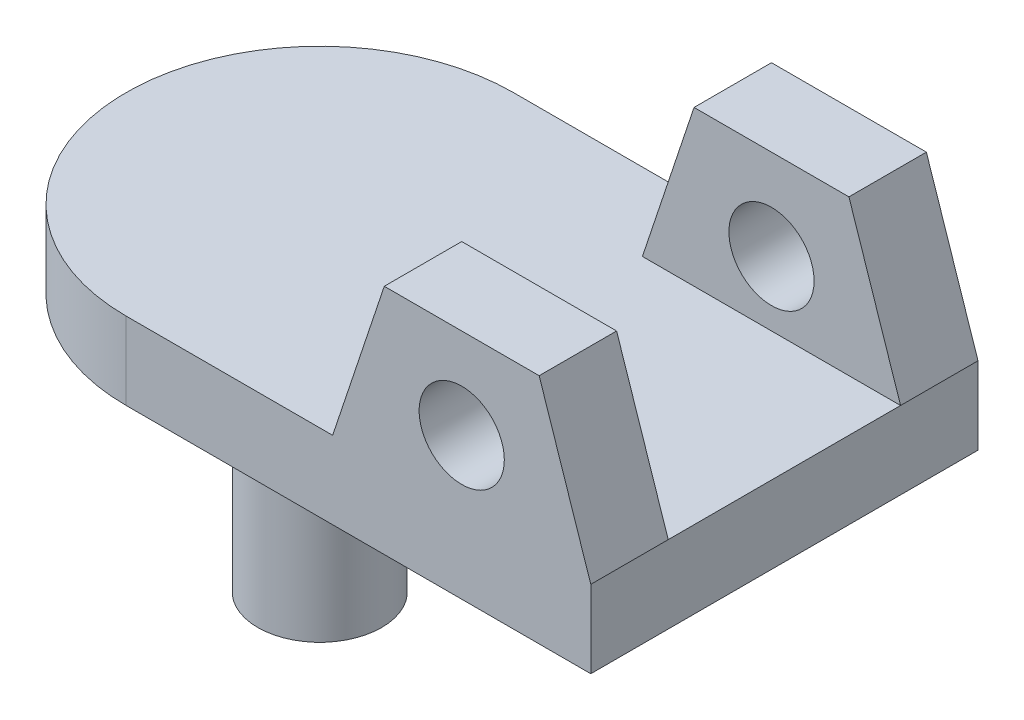
ISO-10303-21;
HEADER;
FILE_DESCRIPTION(('STEP AP214'),'2;1');
FILE_NAME('part.step','',(''),(''),'','','');
FILE_SCHEMA(('AUTOMOTIVE_DESIGN { 1 0 10303 214 1 1 1 1 }'));
ENDSEC;
DATA;
#1=APPLICATION_CONTEXT('core data for automotive mechanical design processes');
#2=APPLICATION_PROTOCOL_DEFINITION('international standard','automotive_design',2000,#1);
#3=PRODUCT_CONTEXT('',#1,'mechanical');
#4=PRODUCT('Part','Part','',(#3));
#5=PRODUCT_RELATED_PRODUCT_CATEGORY('part','',(#4));
#6=PRODUCT_DEFINITION_FORMATION('','',#4);
#7=PRODUCT_DEFINITION_CONTEXT('part definition',#1,'design');
#8=PRODUCT_DEFINITION('design','',#6,#7);
#9=PRODUCT_DEFINITION_SHAPE('','',#8);
#10=(LENGTH_UNIT() NAMED_UNIT(*) SI_UNIT(.MILLI.,.METRE.));
#11=(NAMED_UNIT(*) PLANE_ANGLE_UNIT() SI_UNIT($,.RADIAN.));
#12=(NAMED_UNIT(*) SI_UNIT($,.STERADIAN.) SOLID_ANGLE_UNIT());
#13=UNCERTAINTY_MEASURE_WITH_UNIT(LENGTH_MEASURE(1.E-05),#10,'distance_accuracy_value','');
#14=(GEOMETRIC_REPRESENTATION_CONTEXT(3) GLOBAL_UNCERTAINTY_ASSIGNED_CONTEXT((#13)) GLOBAL_UNIT_ASSIGNED_CONTEXT((#10,
#11,#12)) REPRESENTATION_CONTEXT('',''));
#15=CARTESIAN_POINT('',(0.,0.,0.));
#16=DIRECTION('',(0.,0.,1.));
#17=DIRECTION('',(1.,0.,0.));
#18=AXIS2_PLACEMENT_3D('',#15,#16,#17);
#19=CARTESIAN_POINT('',(0.,3.,0.));
#20=DIRECTION('',(0.,1.,0.));
#21=DIRECTION('',(0.,0.,1.));
#22=AXIS2_PLACEMENT_3D('',#19,#20,#21);
#23=PLANE('',#22);
#24=DIRECTION('',(1.,0.,0.));
#25=VECTOR('',#24,1.);
#26=CARTESIAN_POINT('',(18.,3.,-4.5));
#27=LINE('',#26,#25);
#28=CARTESIAN_POINT('',(8.,3.,-4.5));
#29=VERTEX_POINT('',#28);
#30=CARTESIAN_POINT('',(18.,3.,-4.5));
#31=VERTEX_POINT('',#30);
#32=EDGE_CURVE('E60',#29,#31,#27,.T.);
#33=ORIENTED_EDGE('',*,*,#32,.F.);
#34=DIRECTION('',(0.,0.,-1.));
#35=VECTOR('',#34,1.);
#36=CARTESIAN_POINT('',(8.,3.,-4.5));
#37=LINE('',#36,#35);
#38=CARTESIAN_POINT('',(8.,3.,-7.5));
#39=VERTEX_POINT('',#38);
#40=EDGE_CURVE('E151',#29,#39,#37,.T.);
#41=ORIENTED_EDGE('',*,*,#40,.T.);
#42=DIRECTION('',(-1.,0.,0.));
#43=VECTOR('',#42,1.);
#44=CARTESIAN_POINT('',(0.,3.,-7.5));
#45=LINE('',#44,#43);
#46=CARTESIAN_POINT('',(0.,3.,-7.5));
#47=VERTEX_POINT('',#46);
#48=EDGE_CURVE('E231',#39,#47,#45,.T.);
#49=ORIENTED_EDGE('',*,*,#48,.T.);
#50=CARTESIAN_POINT('',(0.,3.,0.));
#51=DIRECTION('',(0.,1.,0.));
#52=DIRECTION('',(0.,0.,1.));
#53=AXIS2_PLACEMENT_3D('',#50,#51,#52);
#54=CIRCLE('',#53,7.5);
#55=CARTESIAN_POINT('',(0.,3.,7.5));
#56=VERTEX_POINT('',#55);
#57=EDGE_CURVE('E217',#47,#56,#54,.T.);
#58=ORIENTED_EDGE('',*,*,#57,.T.);
#59=DIRECTION('',(1.,0.,0.));
#60=VECTOR('',#59,1.);
#61=CARTESIAN_POINT('',(0.,3.,7.5));
#62=LINE('',#61,#60);
#63=CARTESIAN_POINT('',(8.,3.,7.5));
#64=VERTEX_POINT('',#63);
#65=EDGE_CURVE('E221',#56,#64,#62,.T.);
#66=ORIENTED_EDGE('',*,*,#65,.T.);
#67=DIRECTION('',(0.,0.,1.));
#68=VECTOR('',#67,1.);
#69=CARTESIAN_POINT('',(8.,3.,4.5));
#70=LINE('',#69,#68);
#71=CARTESIAN_POINT('',(8.,3.,4.5));
#72=VERTEX_POINT('',#71);
#73=EDGE_CURVE('E204',#72,#64,#70,.T.);
#74=ORIENTED_EDGE('',*,*,#73,.F.);
#75=DIRECTION('',(1.,0.,0.));
#76=VECTOR('',#75,1.);
#77=CARTESIAN_POINT('',(18.,3.,4.5));
#78=LINE('',#77,#76);
#79=CARTESIAN_POINT('',(18.,3.,4.5));
#80=VERTEX_POINT('',#79);
#81=EDGE_CURVE('E189',#72,#80,#78,.T.);
#82=ORIENTED_EDGE('',*,*,#81,.T.);
#83=DIRECTION('',(0.,0.,-1.));
#84=VECTOR('',#83,1.);
#85=CARTESIAN_POINT('',(18.,3.,-7.5));
#86=LINE('',#85,#84);
#87=EDGE_CURVE('E226',#80,#31,#86,.T.);
#88=ORIENTED_EDGE('',*,*,#87,.T.);
#89=EDGE_LOOP('',(#33,#41,#49,#58,#66,#74,#82,#88));
#90=FACE_BOUND('',#89,.T.);
#91=ADVANCED_FACE('F43',(#90),#23,.T.);
#92=CARTESIAN_POINT('',(0.,3.,0.));
#93=DIRECTION('',(0.,-1.,0.));
#94=DIRECTION('',(0.,0.,-1.));
#95=AXIS2_PLACEMENT_3D('',#92,#93,#94);
#96=CYLINDRICAL_SURFACE('',#95,7.5);
#97=CARTESIAN_POINT('',(0.,0.,0.));
#98=DIRECTION('',(0.,1.,0.));
#99=DIRECTION('',(0.,0.,1.));
#100=AXIS2_PLACEMENT_3D('',#97,#98,#99);
#101=CIRCLE('',#100,7.5);
#102=CARTESIAN_POINT('',(0.,0.,-7.5));
#103=VERTEX_POINT('',#102);
#104=CARTESIAN_POINT('',(0.,0.,7.5));
#105=VERTEX_POINT('',#104);
#106=EDGE_CURVE('E216',#103,#105,#101,.T.);
#107=ORIENTED_EDGE('',*,*,#106,.T.);
#108=DIRECTION('',(0.,-1.,0.));
#109=VECTOR('',#108,1.);
#110=CARTESIAN_POINT('',(0.,3.,7.5));
#111=LINE('',#110,#109);
#112=EDGE_CURVE('E53',#56,#105,#111,.T.);
#113=ORIENTED_EDGE('',*,*,#112,.F.);
#114=ORIENTED_EDGE('',*,*,#57,.F.);
#115=DIRECTION('',(0.,-1.,0.));
#116=VECTOR('',#115,1.);
#117=CARTESIAN_POINT('',(0.,3.,-7.5));
#118=LINE('',#117,#116);
#119=EDGE_CURVE('E234',#47,#103,#118,.T.);
#120=ORIENTED_EDGE('',*,*,#119,.T.);
#121=EDGE_LOOP('',(#107,#113,#114,#120));
#122=FACE_BOUND('',#121,.T.);
#123=ADVANCED_FACE('F45',(#122),#96,.T.);
#124=CARTESIAN_POINT('',(0.,3.,7.5));
#125=DIRECTION('',(0.,0.,-1.));
#126=DIRECTION('',(-1.,0.,0.));
#127=AXIS2_PLACEMENT_3D('',#124,#125,#126);
#128=PLANE('',#127);
#129=CARTESIAN_POINT('',(13.,5.5,7.5));
#130=DIRECTION('',(0.,0.,1.));
#131=DIRECTION('',(1.,0.,0.));
#132=AXIS2_PLACEMENT_3D('',#129,#130,#131);
#133=CIRCLE('',#132,1.65);
#134=CARTESIAN_POINT('',(14.65,5.5,7.5));
#135=VERTEX_POINT('',#134);
#136=EDGE_CURVE('E283',#135,#135,#133,.T.);
#137=ORIENTED_EDGE('',*,*,#136,.F.);
#138=EDGE_LOOP('',(#137));
#139=FACE_BOUND('',#138,.T.);
#140=DIRECTION('',(1.,0.,0.));
#141=VECTOR('',#140,1.);
#142=CARTESIAN_POINT('',(0.,0.,7.5));
#143=LINE('',#142,#141);
#144=CARTESIAN_POINT('',(18.,0.,7.5));
#145=VERTEX_POINT('',#144);
#146=EDGE_CURVE('E238',#105,#145,#143,.T.);
#147=ORIENTED_EDGE('',*,*,#146,.T.);
#148=DIRECTION('',(0.,-1.,0.));
#149=VECTOR('',#148,1.);
#150=CARTESIAN_POINT('',(18.,3.,7.5));
#151=LINE('',#150,#149);
#152=CARTESIAN_POINT('',(18.,3.,7.5));
#153=VERTEX_POINT('',#152);
#154=EDGE_CURVE('E253',#153,#145,#151,.T.);
#155=ORIENTED_EDGE('',*,*,#154,.F.);
#156=DIRECTION('',(-0.316227766016838,0.948683298050514,0.));
#157=VECTOR('',#156,1.);
#158=CARTESIAN_POINT('',(16.,9.,7.5));
#159=LINE('',#158,#157);
#160=CARTESIAN_POINT('',(16.,9.,7.5));
#161=VERTEX_POINT('',#160);
#162=EDGE_CURVE('E171',#153,#161,#159,.T.);
#163=ORIENTED_EDGE('',*,*,#162,.T.);
#164=DIRECTION('',(-1.,0.,0.));
#165=VECTOR('',#164,1.);
#166=CARTESIAN_POINT('',(10.,9.,7.5));
#167=LINE('',#166,#165);
#168=CARTESIAN_POINT('',(10.,9.,7.5));
#169=VERTEX_POINT('',#168);
#170=EDGE_CURVE('E197',#161,#169,#167,.T.);
#171=ORIENTED_EDGE('',*,*,#170,.T.);
#172=DIRECTION('',(-0.316227766016838,-0.948683298050514,0.));
#173=VECTOR('',#172,1.);
#174=CARTESIAN_POINT('',(8.,3.,7.5));
#175=LINE('',#174,#173);
#176=EDGE_CURVE('E182',#169,#64,#175,.T.);
#177=ORIENTED_EDGE('',*,*,#176,.T.);
#178=ORIENTED_EDGE('',*,*,#65,.F.);
#179=ORIENTED_EDGE('',*,*,#112,.T.);
#180=EDGE_LOOP('',(#147,#155,#163,#171,#177,#178,#179));
#181=FACE_BOUND('',#180,.T.);
#182=ADVANCED_FACE('F261',(#139,#181),#128,.F.);
#183=CARTESIAN_POINT('',(18.,3.,-7.5));
#184=DIRECTION('',(-1.,0.,0.));
#185=DIRECTION('',(0.,0.,1.));
#186=AXIS2_PLACEMENT_3D('',#183,#184,#185);
#187=PLANE('',#186);
#188=DIRECTION('',(0.,0.,-1.));
#189=VECTOR('',#188,1.);
#190=CARTESIAN_POINT('',(18.,0.,-7.5));
#191=LINE('',#190,#189);
#192=CARTESIAN_POINT('',(18.,0.,-7.5));
#193=VERTEX_POINT('',#192);
#194=EDGE_CURVE('E241',#145,#193,#191,.T.);
#195=ORIENTED_EDGE('',*,*,#194,.T.);
#196=DIRECTION('',(0.,-1.,0.));
#197=VECTOR('',#196,1.);
#198=CARTESIAN_POINT('',(18.,3.,-7.5));
#199=LINE('',#198,#197);
#200=CARTESIAN_POINT('',(18.,3.,-7.5));
#201=VERTEX_POINT('',#200);
#202=EDGE_CURVE('E249',#201,#193,#199,.T.);
#203=ORIENTED_EDGE('',*,*,#202,.F.);
#204=DIRECTION('',(0.,0.,-1.));
#205=VECTOR('',#204,1.);
#206=CARTESIAN_POINT('',(18.,3.,-4.5));
#207=LINE('',#206,#205);
#208=EDGE_CURVE('E68',#31,#201,#207,.T.);
#209=ORIENTED_EDGE('',*,*,#208,.F.);
#210=ORIENTED_EDGE('',*,*,#87,.F.);
#211=EDGE_CURVE('E227',#153,#80,#86,.T.);
#212=ORIENTED_EDGE('',*,*,#211,.F.);
#213=ORIENTED_EDGE('',*,*,#154,.T.);
#214=EDGE_LOOP('',(#195,#203,#209,#210,#212,#213));
#215=FACE_BOUND('',#214,.T.);
#216=ADVANCED_FACE('F271',(#215),#187,.F.);
#217=CARTESIAN_POINT('',(0.,3.,-7.5));
#218=DIRECTION('',(0.,0.,1.));
#219=DIRECTION('',(1.,0.,0.));
#220=AXIS2_PLACEMENT_3D('',#217,#218,#219);
#221=PLANE('',#220);
#222=CARTESIAN_POINT('',(13.,5.5,-7.5));
#223=DIRECTION('',(0.,0.,1.));
#224=DIRECTION('',(1.,0.,0.));
#225=AXIS2_PLACEMENT_3D('',#222,#223,#224);
#226=CIRCLE('',#225,1.65);
#227=CARTESIAN_POINT('',(14.65,5.5,-7.5));
#228=VERTEX_POINT('',#227);
#229=EDGE_CURVE('E287',#228,#228,#226,.T.);
#230=ORIENTED_EDGE('',*,*,#229,.T.);
#231=EDGE_LOOP('',(#230));
#232=FACE_BOUND('',#231,.T.);
#233=DIRECTION('',(-1.,0.,0.));
#234=VECTOR('',#233,1.);
#235=CARTESIAN_POINT('',(0.,0.,-7.5));
#236=LINE('',#235,#234);
#237=EDGE_CURVE('E222',#193,#103,#236,.T.);
#238=ORIENTED_EDGE('',*,*,#237,.T.);
#239=ORIENTED_EDGE('',*,*,#119,.F.);
#240=ORIENTED_EDGE('',*,*,#48,.F.);
#241=DIRECTION('',(-0.316227766016838,-0.948683298050514,0.));
#242=VECTOR('',#241,1.);
#243=CARTESIAN_POINT('',(8.,3.,-7.5));
#244=LINE('',#243,#242);
#245=CARTESIAN_POINT('',(10.,9.,-7.5));
#246=VERTEX_POINT('',#245);
#247=EDGE_CURVE('E164',#246,#39,#244,.T.);
#248=ORIENTED_EDGE('',*,*,#247,.F.);
#249=DIRECTION('',(-1.,0.,0.));
#250=VECTOR('',#249,1.);
#251=CARTESIAN_POINT('',(10.,9.,-7.5));
#252=LINE('',#251,#250);
#253=CARTESIAN_POINT('',(16.,9.,-7.5));
#254=VERTEX_POINT('',#253);
#255=EDGE_CURVE('E145',#254,#246,#252,.T.);
#256=ORIENTED_EDGE('',*,*,#255,.F.);
#257=DIRECTION('',(-0.316227766016838,0.948683298050514,0.));
#258=VECTOR('',#257,1.);
#259=CARTESIAN_POINT('',(16.,9.,-7.5));
#260=LINE('',#259,#258);
#261=EDGE_CURVE('E160',#201,#254,#260,.T.);
#262=ORIENTED_EDGE('',*,*,#261,.F.);
#263=ORIENTED_EDGE('',*,*,#202,.T.);
#264=EDGE_LOOP('',(#238,#239,#240,#248,#256,#262,#263));
#265=FACE_BOUND('',#264,.T.);
#266=ADVANCED_FACE('F275',(#232,#265),#221,.F.);
#267=CARTESIAN_POINT('',(0.,0.,0.));
#268=DIRECTION('',(0.,1.,0.));
#269=DIRECTION('',(0.,0.,1.));
#270=AXIS2_PLACEMENT_3D('',#267,#268,#269);
#271=PLANE('',#270);
#272=CARTESIAN_POINT('',(0.,0.,0.));
#273=DIRECTION('',(0.,1.,0.));
#274=DIRECTION('',(0.,0.,1.));
#275=AXIS2_PLACEMENT_3D('',#272,#273,#274);
#276=CIRCLE('',#275,2.4);
#277=CARTESIAN_POINT('',(0.,0.,2.4));
#278=VERTEX_POINT('',#277);
#279=EDGE_CURVE('E11',#278,#278,#276,.F.);
#280=ORIENTED_EDGE('',*,*,#279,.F.);
#281=EDGE_LOOP('',(#280));
#282=FACE_BOUND('',#281,.T.);
#283=ORIENTED_EDGE('',*,*,#106,.F.);
#284=ORIENTED_EDGE('',*,*,#237,.F.);
#285=ORIENTED_EDGE('',*,*,#194,.F.);
#286=ORIENTED_EDGE('',*,*,#146,.F.);
#287=EDGE_LOOP('',(#283,#284,#285,#286));
#288=FACE_BOUND('',#287,.T.);
#289=ADVANCED_FACE('F269',(#282,#288),#271,.F.);
#290=CARTESIAN_POINT('',(0.,-10.,0.));
#291=DIRECTION('',(0.,1.,0.));
#292=DIRECTION('',(0.,0.,1.));
#293=AXIS2_PLACEMENT_3D('',#290,#291,#292);
#294=CYLINDRICAL_SURFACE('',#293,2.4);
#295=CARTESIAN_POINT('',(0.,-10.,0.));
#296=DIRECTION('',(0.,-1.,0.));
#297=DIRECTION('',(0.,0.,-1.));
#298=AXIS2_PLACEMENT_3D('',#295,#296,#297);
#299=CIRCLE('',#298,2.4);
#300=CARTESIAN_POINT('',(0.,-10.,-2.4));
#301=VERTEX_POINT('',#300);
#302=EDGE_CURVE('E207',#301,#301,#299,.T.);
#303=ORIENTED_EDGE('',*,*,#302,.F.);
#304=EDGE_LOOP('',(#303));
#305=FACE_BOUND('',#304,.T.);
#306=ORIENTED_EDGE('',*,*,#279,.T.);
#307=EDGE_LOOP('',(#306));
#308=FACE_BOUND('',#307,.T.);
#309=ADVANCED_FACE('F316',(#305,#308),#294,.T.);
#310=CARTESIAN_POINT('',(0.,-10.,0.));
#311=DIRECTION('',(0.,-1.,0.));
#312=DIRECTION('',(0.,0.,-1.));
#313=AXIS2_PLACEMENT_3D('',#310,#311,#312);
#314=PLANE('',#313);
#315=ORIENTED_EDGE('',*,*,#302,.T.);
#316=EDGE_LOOP('',(#315));
#317=FACE_BOUND('',#316,.T.);
#318=ADVANCED_FACE('F361',(#317),#314,.T.);
#319=CARTESIAN_POINT('',(16.,9.,4.5));
#320=DIRECTION('',(0.948683298050514,0.316227766016838,0.));
#321=DIRECTION('',(-0.316227766016838,0.948683298050514,0.));
#322=AXIS2_PLACEMENT_3D('',#319,#320,#321);
#323=PLANE('',#322);
#324=ORIENTED_EDGE('',*,*,#162,.F.);
#325=ORIENTED_EDGE('',*,*,#211,.T.);
#326=DIRECTION('',(-0.316227766016838,0.948683298050514,0.));
#327=VECTOR('',#326,1.);
#328=CARTESIAN_POINT('',(16.,9.,4.5));
#329=LINE('',#328,#327);
#330=CARTESIAN_POINT('',(16.,9.,4.5));
#331=VERTEX_POINT('',#330);
#332=EDGE_CURVE('E177',#80,#331,#329,.T.);
#333=ORIENTED_EDGE('',*,*,#332,.T.);
#334=DIRECTION('',(0.,0.,1.));
#335=VECTOR('',#334,1.);
#336=CARTESIAN_POINT('',(16.,9.,4.5));
#337=LINE('',#336,#335);
#338=EDGE_CURVE('E193',#331,#161,#337,.T.);
#339=ORIENTED_EDGE('',*,*,#338,.T.);
#340=EDGE_LOOP('',(#324,#325,#333,#339));
#341=FACE_BOUND('',#340,.T.);
#342=ADVANCED_FACE('F346',(#341),#323,.T.);
#343=CARTESIAN_POINT('',(8.,3.,4.5));
#344=DIRECTION('',(-0.948683298050514,0.316227766016838,0.));
#345=DIRECTION('',(-0.316227766016838,-0.948683298050514,0.));
#346=AXIS2_PLACEMENT_3D('',#343,#344,#345);
#347=PLANE('',#346);
#348=ORIENTED_EDGE('',*,*,#176,.F.);
#349=DIRECTION('',(0.,0.,1.));
#350=VECTOR('',#349,1.);
#351=CARTESIAN_POINT('',(10.,9.,4.5));
#352=LINE('',#351,#350);
#353=CARTESIAN_POINT('',(10.,9.,4.5));
#354=VERTEX_POINT('',#353);
#355=EDGE_CURVE('E208',#354,#169,#352,.T.);
#356=ORIENTED_EDGE('',*,*,#355,.F.);
#357=DIRECTION('',(-0.316227766016838,-0.948683298050514,0.));
#358=VECTOR('',#357,1.);
#359=CARTESIAN_POINT('',(8.,3.,4.5));
#360=LINE('',#359,#358);
#361=EDGE_CURVE('E186',#354,#72,#360,.T.);
#362=ORIENTED_EDGE('',*,*,#361,.T.);
#363=ORIENTED_EDGE('',*,*,#73,.T.);
#364=EDGE_LOOP('',(#348,#356,#362,#363));
#365=FACE_BOUND('',#364,.T.);
#366=ADVANCED_FACE('F350',(#365),#347,.T.);
#367=CARTESIAN_POINT('',(10.,9.,4.5));
#368=DIRECTION('',(0.,1.,0.));
#369=DIRECTION('',(0.,0.,1.));
#370=AXIS2_PLACEMENT_3D('',#367,#368,#369);
#371=PLANE('',#370);
#372=ORIENTED_EDGE('',*,*,#170,.F.);
#373=ORIENTED_EDGE('',*,*,#338,.F.);
#374=DIRECTION('',(-1.,0.,0.));
#375=VECTOR('',#374,1.);
#376=CARTESIAN_POINT('',(10.,9.,4.5));
#377=LINE('',#376,#375);
#378=EDGE_CURVE('E181',#331,#354,#377,.T.);
#379=ORIENTED_EDGE('',*,*,#378,.T.);
#380=ORIENTED_EDGE('',*,*,#355,.T.);
#381=EDGE_LOOP('',(#372,#373,#379,#380));
#382=FACE_BOUND('',#381,.T.);
#383=ADVANCED_FACE('F339',(#382),#371,.T.);
#384=CARTESIAN_POINT('',(0.,0.,4.5));
#385=DIRECTION('',(0.,0.,-1.));
#386=DIRECTION('',(-1.,0.,0.));
#387=AXIS2_PLACEMENT_3D('',#384,#385,#386);
#388=PLANE('',#387);
#389=CARTESIAN_POINT('',(13.,5.5,4.5));
#390=DIRECTION('',(0.,0.,-1.));
#391=DIRECTION('',(-1.,0.,0.));
#392=AXIS2_PLACEMENT_3D('',#389,#390,#391);
#393=CIRCLE('',#392,1.65);
#394=CARTESIAN_POINT('',(11.35,5.5,4.5));
#395=VERTEX_POINT('',#394);
#396=EDGE_CURVE('E165',#395,#395,#393,.T.);
#397=ORIENTED_EDGE('',*,*,#396,.F.);
#398=EDGE_LOOP('',(#397));
#399=FACE_BOUND('',#398,.T.);
#400=ORIENTED_EDGE('',*,*,#332,.F.);
#401=ORIENTED_EDGE('',*,*,#81,.F.);
#402=ORIENTED_EDGE('',*,*,#361,.F.);
#403=ORIENTED_EDGE('',*,*,#378,.F.);
#404=EDGE_LOOP('',(#400,#401,#402,#403));
#405=FACE_BOUND('',#404,.T.);
#406=ADVANCED_FACE('F336',(#399,#405),#388,.T.);
#407=CARTESIAN_POINT('',(16.,9.,-4.5));
#408=DIRECTION('',(-0.948683298050514,-0.316227766016838,0.));
#409=DIRECTION('',(0.316227766016838,-0.948683298050514,0.));
#410=AXIS2_PLACEMENT_3D('',#407,#408,#409);
#411=PLANE('',#410);
#412=ORIENTED_EDGE('',*,*,#261,.T.);
#413=DIRECTION('',(0.,0.,-1.));
#414=VECTOR('',#413,1.);
#415=CARTESIAN_POINT('',(16.,9.,-4.5));
#416=LINE('',#415,#414);
#417=CARTESIAN_POINT('',(16.,9.,-4.5));
#418=VERTEX_POINT('',#417);
#419=EDGE_CURVE('E150',#418,#254,#416,.T.);
#420=ORIENTED_EDGE('',*,*,#419,.F.);
#421=DIRECTION('',(-0.316227766016838,0.948683298050514,0.));
#422=VECTOR('',#421,1.);
#423=CARTESIAN_POINT('',(16.,9.,-4.5));
#424=LINE('',#423,#422);
#425=EDGE_CURVE('E136',#31,#418,#424,.T.);
#426=ORIENTED_EDGE('',*,*,#425,.F.);
#427=ORIENTED_EDGE('',*,*,#208,.T.);
#428=EDGE_LOOP('',(#412,#420,#426,#427));
#429=FACE_BOUND('',#428,.T.);
#430=ADVANCED_FACE('F277',(#429),#411,.F.);
#431=CARTESIAN_POINT('',(10.,9.,-4.5));
#432=DIRECTION('',(0.,-1.,0.));
#433=DIRECTION('',(0.,0.,-1.));
#434=AXIS2_PLACEMENT_3D('',#431,#432,#433);
#435=PLANE('',#434);
#436=ORIENTED_EDGE('',*,*,#255,.T.);
#437=DIRECTION('',(0.,0.,-1.));
#438=VECTOR('',#437,1.);
#439=CARTESIAN_POINT('',(10.,9.,-4.5));
#440=LINE('',#439,#438);
#441=CARTESIAN_POINT('',(10.,9.,-4.5));
#442=VERTEX_POINT('',#441);
#443=EDGE_CURVE('E143',#442,#246,#440,.T.);
#444=ORIENTED_EDGE('',*,*,#443,.F.);
#445=DIRECTION('',(-1.,0.,0.));
#446=VECTOR('',#445,1.);
#447=CARTESIAN_POINT('',(10.,9.,-4.5));
#448=LINE('',#447,#446);
#449=EDGE_CURVE('E129',#418,#442,#448,.T.);
#450=ORIENTED_EDGE('',*,*,#449,.F.);
#451=ORIENTED_EDGE('',*,*,#419,.T.);
#452=EDGE_LOOP('',(#436,#444,#450,#451));
#453=FACE_BOUND('',#452,.T.);
#454=ADVANCED_FACE('F144',(#453),#435,.F.);
#455=CARTESIAN_POINT('',(8.,3.,-4.5));
#456=DIRECTION('',(0.948683298050514,-0.316227766016838,0.));
#457=DIRECTION('',(0.316227766016838,0.948683298050514,0.));
#458=AXIS2_PLACEMENT_3D('',#455,#456,#457);
#459=PLANE('',#458);
#460=ORIENTED_EDGE('',*,*,#247,.T.);
#461=ORIENTED_EDGE('',*,*,#40,.F.);
#462=DIRECTION('',(-0.316227766016838,-0.948683298050514,0.));
#463=VECTOR('',#462,1.);
#464=CARTESIAN_POINT('',(8.,3.,-4.5));
#465=LINE('',#464,#463);
#466=EDGE_CURVE('E133',#442,#29,#465,.T.);
#467=ORIENTED_EDGE('',*,*,#466,.F.);
#468=ORIENTED_EDGE('',*,*,#443,.T.);
#469=EDGE_LOOP('',(#460,#461,#467,#468));
#470=FACE_BOUND('',#469,.T.);
#471=ADVANCED_FACE('F153',(#470),#459,.F.);
#472=CARTESIAN_POINT('',(0.,0.,-4.5));
#473=DIRECTION('',(0.,0.,1.));
#474=DIRECTION('',(-1.,0.,0.));
#475=AXIS2_PLACEMENT_3D('',#472,#473,#474);
#476=PLANE('',#475);
#477=CARTESIAN_POINT('',(13.,5.5,-4.5));
#478=DIRECTION('',(0.,0.,1.));
#479=DIRECTION('',(1.,0.,0.));
#480=AXIS2_PLACEMENT_3D('',#477,#478,#479);
#481=CIRCLE('',#480,1.65);
#482=CARTESIAN_POINT('',(14.65,5.5,-4.5));
#483=VERTEX_POINT('',#482);
#484=EDGE_CURVE('E47',#483,#483,#481,.T.);
#485=ORIENTED_EDGE('',*,*,#484,.F.);
#486=EDGE_LOOP('',(#485));
#487=FACE_BOUND('',#486,.T.);
#488=ORIENTED_EDGE('',*,*,#425,.T.);
#489=ORIENTED_EDGE('',*,*,#449,.T.);
#490=ORIENTED_EDGE('',*,*,#466,.T.);
#491=ORIENTED_EDGE('',*,*,#32,.T.);
#492=EDGE_LOOP('',(#488,#489,#490,#491));
#493=FACE_BOUND('',#492,.T.);
#494=ADVANCED_FACE('F131',(#487,#493),#476,.T.);
#495=CARTESIAN_POINT('',(13.,5.5,-7.5));
#496=DIRECTION('',(0.,0.,1.));
#497=DIRECTION('',(1.,0.,0.));
#498=AXIS2_PLACEMENT_3D('',#495,#496,#497);
#499=CYLINDRICAL_SURFACE('',#498,1.65);
#500=ORIENTED_EDGE('',*,*,#484,.T.);
#501=EDGE_LOOP('',(#500));
#502=FACE_BOUND('',#501,.T.);
#503=ORIENTED_EDGE('',*,*,#229,.F.);
#504=EDGE_LOOP('',(#503));
#505=FACE_BOUND('',#504,.T.);
#506=ADVANCED_FACE('F296',(#502,#505),#499,.F.);
#507=ORIENTED_EDGE('',*,*,#396,.T.);
#508=EDGE_LOOP('',(#507));
#509=FACE_BOUND('',#508,.T.);
#510=ORIENTED_EDGE('',*,*,#136,.T.);
#511=EDGE_LOOP('',(#510));
#512=FACE_BOUND('',#511,.T.);
#513=ADVANCED_FACE('F305',(#509,#512),#499,.F.);
#514=CLOSED_SHELL('',(#91,#123,#182,#216,#266,#289,#309,#318,#342,#366,#383,#406,#430,#454,#471,
#494,#506,#513));
#515=MANIFOLD_SOLID_BREP('B2',#514);
#516=ADVANCED_BREP_SHAPE_REPRESENTATION('',(#18,#515),#14);
#517=SHAPE_DEFINITION_REPRESENTATION(#9,#516);
ENDSEC;
END-ISO-10303-21;
